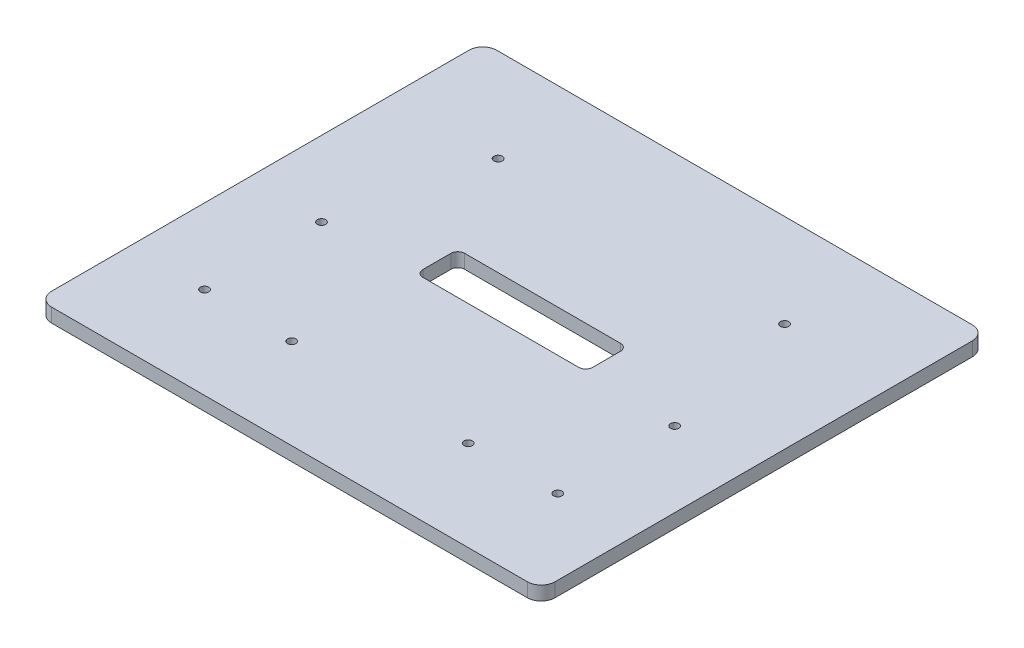
ISO-10303-21;
HEADER;
FILE_DESCRIPTION(('STEP AP214'),'2;1');
FILE_NAME('part.step','',(''),(''),'','','');
FILE_SCHEMA(('AUTOMOTIVE_DESIGN { 1 0 10303 214 1 1 1 1 }'));
ENDSEC;
DATA;
#1=APPLICATION_CONTEXT('core data for automotive mechanical design processes');
#2=APPLICATION_PROTOCOL_DEFINITION('international standard','automotive_design',2000,#1);
#3=PRODUCT_CONTEXT('',#1,'mechanical');
#4=PRODUCT('Part','Part','',(#3));
#5=PRODUCT_RELATED_PRODUCT_CATEGORY('part','',(#4));
#6=PRODUCT_DEFINITION_FORMATION('','',#4);
#7=PRODUCT_DEFINITION_CONTEXT('part definition',#1,'design');
#8=PRODUCT_DEFINITION('design','',#6,#7);
#9=PRODUCT_DEFINITION_SHAPE('','',#8);
#10=(LENGTH_UNIT() NAMED_UNIT(*) SI_UNIT(.MILLI.,.METRE.));
#11=(NAMED_UNIT(*) PLANE_ANGLE_UNIT() SI_UNIT($,.RADIAN.));
#12=(NAMED_UNIT(*) SI_UNIT($,.STERADIAN.) SOLID_ANGLE_UNIT());
#13=UNCERTAINTY_MEASURE_WITH_UNIT(LENGTH_MEASURE(1.E-05),#10,'distance_accuracy_value','');
#14=(GEOMETRIC_REPRESENTATION_CONTEXT(3) GLOBAL_UNCERTAINTY_ASSIGNED_CONTEXT((#13)) GLOBAL_UNIT_ASSIGNED_CONTEXT((#10,
#11,#12)) REPRESENTATION_CONTEXT('',''));
#15=CARTESIAN_POINT('',(0.,0.,0.));
#16=DIRECTION('',(0.,0.,1.));
#17=DIRECTION('',(1.,0.,0.));
#18=AXIS2_PLACEMENT_3D('',#15,#16,#17);
#19=CARTESIAN_POINT('',(109.134216211139,5.,-126.661644013292));
#20=DIRECTION('',(0.,-1.,0.));
#21=DIRECTION('',(0.,0.,-1.));
#22=AXIS2_PLACEMENT_3D('',#19,#20,#21);
#23=CYLINDRICAL_SURFACE('',#22,5.00000000000001);
#24=CARTESIAN_POINT('',(109.134216211139,0.,-126.661644013292));
#25=DIRECTION('',(0.,1.,0.));
#26=DIRECTION('',(0.,0.,-1.));
#27=AXIS2_PLACEMENT_3D('',#24,#25,#26);
#28=CIRCLE('',#27,5.00000000000001);
#29=CARTESIAN_POINT('',(114.134216211139,0.,-126.661644013292));
#30=VERTEX_POINT('',#29);
#31=CARTESIAN_POINT('',(109.134216211139,0.,-131.661644013292));
#32=VERTEX_POINT('',#31);
#33=EDGE_CURVE('E229',#30,#32,#28,.T.);
#34=ORIENTED_EDGE('',*,*,#33,.T.);
#35=DIRECTION('',(0.,-1.,0.));
#36=VECTOR('',#35,1.);
#37=CARTESIAN_POINT('',(109.134216211139,5.,-131.661644013292));
#38=LINE('',#37,#36);
#39=CARTESIAN_POINT('',(109.134216211139,5.,-131.661644013292));
#40=VERTEX_POINT('',#39);
#41=EDGE_CURVE('E286',#40,#32,#38,.T.);
#42=ORIENTED_EDGE('',*,*,#41,.F.);
#43=CARTESIAN_POINT('',(109.134216211139,5.,-126.661644013292));
#44=DIRECTION('',(0.,1.,0.));
#45=DIRECTION('',(0.,0.,-1.));
#46=AXIS2_PLACEMENT_3D('',#43,#44,#45);
#47=CIRCLE('',#46,5.00000000000001);
#48=CARTESIAN_POINT('',(114.134216211139,5.,-126.661644013292));
#49=VERTEX_POINT('',#48);
#50=EDGE_CURVE('E232',#49,#40,#47,.T.);
#51=ORIENTED_EDGE('',*,*,#50,.F.);
#52=DIRECTION('',(0.,-1.,0.));
#53=VECTOR('',#52,1.);
#54=CARTESIAN_POINT('',(114.134216211139,5.,-126.661644013292));
#55=LINE('',#54,#53);
#56=EDGE_CURVE('E250',#49,#30,#55,.T.);
#57=ORIENTED_EDGE('',*,*,#56,.T.);
#58=EDGE_LOOP('',(#34,#42,#51,#57));
#59=FACE_BOUND('',#58,.T.);
#60=ADVANCED_FACE('F32',(#59),#23,.T.);
#61=CARTESIAN_POINT('',(-61.8657837888607,5.,-131.661644013292));
#62=DIRECTION('',(0.,0.,1.));
#63=DIRECTION('',(1.,0.,0.));
#64=AXIS2_PLACEMENT_3D('',#61,#62,#63);
#65=PLANE('',#64);
#66=DIRECTION('',(-1.,0.,0.));
#67=VECTOR('',#66,1.);
#68=CARTESIAN_POINT('',(-61.8657837888607,0.,-131.661644013292));
#69=LINE('',#68,#67);
#70=CARTESIAN_POINT('',(-61.8657837888607,0.,-131.661644013292));
#71=VERTEX_POINT('',#70);
#72=EDGE_CURVE('E253',#32,#71,#69,.T.);
#73=ORIENTED_EDGE('',*,*,#72,.T.);
#74=DIRECTION('',(0.,-1.,0.));
#75=VECTOR('',#74,1.);
#76=CARTESIAN_POINT('',(-61.8657837888607,5.,-131.661644013292));
#77=LINE('',#76,#75);
#78=CARTESIAN_POINT('',(-61.8657837888607,5.,-131.661644013292));
#79=VERTEX_POINT('',#78);
#80=EDGE_CURVE('E283',#79,#71,#77,.T.);
#81=ORIENTED_EDGE('',*,*,#80,.F.);
#82=DIRECTION('',(-1.,0.,0.));
#83=VECTOR('',#82,1.);
#84=CARTESIAN_POINT('',(-61.8657837888607,5.,-131.661644013292));
#85=LINE('',#84,#83);
#86=EDGE_CURVE('E235',#40,#79,#85,.T.);
#87=ORIENTED_EDGE('',*,*,#86,.F.);
#88=ORIENTED_EDGE('',*,*,#41,.T.);
#89=EDGE_LOOP('',(#73,#81,#87,#88));
#90=FACE_BOUND('',#89,.T.);
#91=ADVANCED_FACE('F349',(#90),#65,.F.);
#92=CARTESIAN_POINT('',(-61.8657837888607,5.,-126.661644013292));
#93=DIRECTION('',(0.,-1.,0.));
#94=DIRECTION('',(0.,0.,-1.));
#95=AXIS2_PLACEMENT_3D('',#92,#93,#94);
#96=CYLINDRICAL_SURFACE('',#95,4.99999999999999);
#97=CARTESIAN_POINT('',(-61.8657837888607,0.,-126.661644013292));
#98=DIRECTION('',(0.,1.,0.));
#99=DIRECTION('',(0.,0.,1.));
#100=AXIS2_PLACEMENT_3D('',#97,#98,#99);
#101=CIRCLE('',#100,4.99999999999999);
#102=CARTESIAN_POINT('',(-66.8657837888607,0.,-126.661644013292));
#103=VERTEX_POINT('',#102);
#104=EDGE_CURVE('E255',#71,#103,#101,.T.);
#105=ORIENTED_EDGE('',*,*,#104,.T.);
#106=DIRECTION('',(0.,-1.,0.));
#107=VECTOR('',#106,1.);
#108=CARTESIAN_POINT('',(-66.8657837888607,5.,-126.661644013292));
#109=LINE('',#108,#107);
#110=CARTESIAN_POINT('',(-66.8657837888607,5.,-126.661644013292));
#111=VERTEX_POINT('',#110);
#112=EDGE_CURVE('E280',#111,#103,#109,.T.);
#113=ORIENTED_EDGE('',*,*,#112,.F.);
#114=CARTESIAN_POINT('',(-61.8657837888607,5.,-126.661644013292));
#115=DIRECTION('',(0.,1.,0.));
#116=DIRECTION('',(0.,0.,1.));
#117=AXIS2_PLACEMENT_3D('',#114,#115,#116);
#118=CIRCLE('',#117,4.99999999999999);
#119=EDGE_CURVE('E238',#79,#111,#118,.T.);
#120=ORIENTED_EDGE('',*,*,#119,.F.);
#121=ORIENTED_EDGE('',*,*,#80,.T.);
#122=EDGE_LOOP('',(#105,#113,#120,#121));
#123=FACE_BOUND('',#122,.T.);
#124=ADVANCED_FACE('F354',(#123),#96,.T.);
#125=CARTESIAN_POINT('',(-66.8657837888607,5.,-126.661644013292));
#126=DIRECTION('',(1.,0.,0.));
#127=DIRECTION('',(0.,0.,-1.));
#128=AXIS2_PLACEMENT_3D('',#125,#126,#127);
#129=PLANE('',#128);
#130=DIRECTION('',(0.,0.,1.));
#131=VECTOR('',#130,1.);
#132=CARTESIAN_POINT('',(-66.8657837888607,0.,-126.661644013292));
#133=LINE('',#132,#131);
#134=CARTESIAN_POINT('',(-66.8657837888607,0.,23.3383559867076));
#135=VERTEX_POINT('',#134);
#136=EDGE_CURVE('E257',#103,#135,#133,.T.);
#137=ORIENTED_EDGE('',*,*,#136,.T.);
#138=DIRECTION('',(0.,-1.,0.));
#139=VECTOR('',#138,1.);
#140=CARTESIAN_POINT('',(-66.8657837888607,5.,23.3383559867076));
#141=LINE('',#140,#139);
#142=CARTESIAN_POINT('',(-66.8657837888607,5.,23.3383559867076));
#143=VERTEX_POINT('',#142);
#144=EDGE_CURVE('E277',#143,#135,#141,.T.);
#145=ORIENTED_EDGE('',*,*,#144,.F.);
#146=DIRECTION('',(0.,0.,1.));
#147=VECTOR('',#146,1.);
#148=CARTESIAN_POINT('',(-66.8657837888607,5.,-126.661644013292));
#149=LINE('',#148,#147);
#150=EDGE_CURVE('E240',#111,#143,#149,.T.);
#151=ORIENTED_EDGE('',*,*,#150,.F.);
#152=ORIENTED_EDGE('',*,*,#112,.T.);
#153=EDGE_LOOP('',(#137,#145,#151,#152));
#154=FACE_BOUND('',#153,.T.);
#155=ADVANCED_FACE('F388',(#154),#129,.F.);
#156=CARTESIAN_POINT('',(-61.8657837888607,5.,23.3383559867076));
#157=DIRECTION('',(0.,-1.,0.));
#158=DIRECTION('',(0.,0.,-1.));
#159=AXIS2_PLACEMENT_3D('',#156,#157,#158);
#160=CYLINDRICAL_SURFACE('',#159,5.);
#161=CARTESIAN_POINT('',(-61.8657837888607,0.,23.3383559867076));
#162=DIRECTION('',(0.,1.,0.));
#163=DIRECTION('',(0.,0.,-1.));
#164=AXIS2_PLACEMENT_3D('',#161,#162,#163);
#165=CIRCLE('',#164,5.);
#166=CARTESIAN_POINT('',(-61.8657837888607,0.,28.3383559867076));
#167=VERTEX_POINT('',#166);
#168=EDGE_CURVE('E259',#135,#167,#165,.T.);
#169=ORIENTED_EDGE('',*,*,#168,.T.);
#170=DIRECTION('',(0.,-1.,0.));
#171=VECTOR('',#170,1.);
#172=CARTESIAN_POINT('',(-61.8657837888607,5.,28.3383559867076));
#173=LINE('',#172,#171);
#174=CARTESIAN_POINT('',(-61.8657837888607,5.,28.3383559867076));
#175=VERTEX_POINT('',#174);
#176=EDGE_CURVE('E274',#175,#167,#173,.T.);
#177=ORIENTED_EDGE('',*,*,#176,.F.);
#178=CARTESIAN_POINT('',(-61.8657837888607,5.,23.3383559867076));
#179=DIRECTION('',(0.,1.,0.));
#180=DIRECTION('',(0.,0.,-1.));
#181=AXIS2_PLACEMENT_3D('',#178,#179,#180);
#182=CIRCLE('',#181,5.);
#183=EDGE_CURVE('E242',#143,#175,#182,.T.);
#184=ORIENTED_EDGE('',*,*,#183,.F.);
#185=ORIENTED_EDGE('',*,*,#144,.T.);
#186=EDGE_LOOP('',(#169,#177,#184,#185));
#187=FACE_BOUND('',#186,.T.);
#188=ADVANCED_FACE('F384',(#187),#160,.T.);
#189=CARTESIAN_POINT('',(-61.8657837888607,5.,28.3383559867076));
#190=DIRECTION('',(0.,0.,-1.));
#191=DIRECTION('',(-1.,0.,0.));
#192=AXIS2_PLACEMENT_3D('',#189,#190,#191);
#193=PLANE('',#192);
#194=DIRECTION('',(1.,0.,0.));
#195=VECTOR('',#194,1.);
#196=CARTESIAN_POINT('',(-61.8657837888607,0.,28.3383559867076));
#197=LINE('',#196,#195);
#198=CARTESIAN_POINT('',(109.134216211139,0.,28.3383559867076));
#199=VERTEX_POINT('',#198);
#200=EDGE_CURVE('E261',#167,#199,#197,.T.);
#201=ORIENTED_EDGE('',*,*,#200,.T.);
#202=DIRECTION('',(0.,-1.,0.));
#203=VECTOR('',#202,1.);
#204=CARTESIAN_POINT('',(109.134216211139,5.,28.3383559867076));
#205=LINE('',#204,#203);
#206=CARTESIAN_POINT('',(109.134216211139,5.,28.3383559867076));
#207=VERTEX_POINT('',#206);
#208=EDGE_CURVE('E271',#207,#199,#205,.T.);
#209=ORIENTED_EDGE('',*,*,#208,.F.);
#210=DIRECTION('',(1.,0.,0.));
#211=VECTOR('',#210,1.);
#212=CARTESIAN_POINT('',(-61.8657837888607,5.,28.3383559867076));
#213=LINE('',#212,#211);
#214=EDGE_CURVE('E244',#175,#207,#213,.T.);
#215=ORIENTED_EDGE('',*,*,#214,.F.);
#216=ORIENTED_EDGE('',*,*,#176,.T.);
#217=EDGE_LOOP('',(#201,#209,#215,#216));
#218=FACE_BOUND('',#217,.T.);
#219=ADVANCED_FACE('F379',(#218),#193,.F.);
#220=CARTESIAN_POINT('',(109.134216211139,5.,23.3383559867076));
#221=DIRECTION('',(0.,-1.,0.));
#222=DIRECTION('',(0.,0.,-1.));
#223=AXIS2_PLACEMENT_3D('',#220,#221,#222);
#224=CYLINDRICAL_SURFACE('',#223,5.);
#225=CARTESIAN_POINT('',(109.134216211139,0.,23.3383559867076));
#226=DIRECTION('',(0.,1.,0.));
#227=DIRECTION('',(0.,0.,1.));
#228=AXIS2_PLACEMENT_3D('',#225,#226,#227);
#229=CIRCLE('',#228,5.);
#230=CARTESIAN_POINT('',(114.134216211139,0.,23.3383559867076));
#231=VERTEX_POINT('',#230);
#232=EDGE_CURVE('E263',#199,#231,#229,.T.);
#233=ORIENTED_EDGE('',*,*,#232,.T.);
#234=DIRECTION('',(0.,-1.,0.));
#235=VECTOR('',#234,1.);
#236=CARTESIAN_POINT('',(114.134216211139,5.,23.3383559867076));
#237=LINE('',#236,#235);
#238=CARTESIAN_POINT('',(114.134216211139,5.,23.3383559867076));
#239=VERTEX_POINT('',#238);
#240=EDGE_CURVE('E268',#239,#231,#237,.T.);
#241=ORIENTED_EDGE('',*,*,#240,.F.);
#242=CARTESIAN_POINT('',(109.134216211139,5.,23.3383559867076));
#243=DIRECTION('',(0.,1.,0.));
#244=DIRECTION('',(0.,0.,1.));
#245=AXIS2_PLACEMENT_3D('',#242,#243,#244);
#246=CIRCLE('',#245,5.);
#247=EDGE_CURVE('E246',#207,#239,#246,.T.);
#248=ORIENTED_EDGE('',*,*,#247,.F.);
#249=ORIENTED_EDGE('',*,*,#208,.T.);
#250=EDGE_LOOP('',(#233,#241,#248,#249));
#251=FACE_BOUND('',#250,.T.);
#252=ADVANCED_FACE('F374',(#251),#224,.T.);
#253=CARTESIAN_POINT('',(114.134216211139,5.,-126.661644013292));
#254=DIRECTION('',(-1.,0.,0.));
#255=DIRECTION('',(0.,0.,1.));
#256=AXIS2_PLACEMENT_3D('',#253,#254,#255);
#257=PLANE('',#256);
#258=DIRECTION('',(0.,0.,-1.));
#259=VECTOR('',#258,1.);
#260=CARTESIAN_POINT('',(114.134216211139,0.,-126.661644013292));
#261=LINE('',#260,#259);
#262=EDGE_CURVE('E236',#231,#30,#261,.T.);
#263=ORIENTED_EDGE('',*,*,#262,.T.);
#264=ORIENTED_EDGE('',*,*,#56,.F.);
#265=DIRECTION('',(0.,0.,-1.));
#266=VECTOR('',#265,1.);
#267=CARTESIAN_POINT('',(114.134216211139,5.,-126.661644013292));
#268=LINE('',#267,#266);
#269=EDGE_CURVE('E248',#239,#49,#268,.T.);
#270=ORIENTED_EDGE('',*,*,#269,.F.);
#271=ORIENTED_EDGE('',*,*,#240,.T.);
#272=EDGE_LOOP('',(#263,#264,#270,#271));
#273=FACE_BOUND('',#272,.T.);
#274=ADVANCED_FACE('F372',(#273),#257,.F.);
#275=CARTESIAN_POINT('',(109.134216211139,5.,-126.661644013292));
#276=DIRECTION('',(0.,-1.,0.));
#277=DIRECTION('',(0.,0.,-1.));
#278=AXIS2_PLACEMENT_3D('',#275,#276,#277);
#279=PLANE('',#278);
#280=DIRECTION('',(-1.,0.,0.));
#281=VECTOR('',#280,1.);
#282=CARTESIAN_POINT('',(-4.36578378886074,5.,-62.6616440132924));
#283=LINE('',#282,#281);
#284=CARTESIAN_POINT('',(51.6342162111393,5.,-62.6616440132924));
#285=VERTEX_POINT('',#284);
#286=CARTESIAN_POINT('',(-4.36578378886074,5.,-62.6616440132924));
#287=VERTEX_POINT('',#286);
#288=EDGE_CURVE('E155',#285,#287,#283,.T.);
#289=ORIENTED_EDGE('',*,*,#288,.F.);
#290=CARTESIAN_POINT('',(51.6342162111393,5.,-60.1616440132924));
#291=DIRECTION('',(0.,1.,0.));
#292=DIRECTION('',(0.,0.,1.));
#293=AXIS2_PLACEMENT_3D('',#290,#291,#292);
#294=CIRCLE('',#293,2.5);
#295=CARTESIAN_POINT('',(54.1342162111393,5.,-60.1616440132924));
#296=VERTEX_POINT('',#295);
#297=EDGE_CURVE('E46',#296,#285,#294,.T.);
#298=ORIENTED_EDGE('',*,*,#297,.F.);
#299=DIRECTION('',(0.,0.,-1.));
#300=VECTOR('',#299,1.);
#301=CARTESIAN_POINT('',(54.1342162111393,5.,-60.1616440132924));
#302=LINE('',#301,#300);
#303=CARTESIAN_POINT('',(54.1342162111393,5.,-50.1616440132924));
#304=VERTEX_POINT('',#303);
#305=EDGE_CURVE('E177',#304,#296,#302,.T.);
#306=ORIENTED_EDGE('',*,*,#305,.F.);
#307=CARTESIAN_POINT('',(51.6342162111393,5.,-50.1616440132924));
#308=DIRECTION('',(0.,1.,0.));
#309=DIRECTION('',(0.,0.,-1.));
#310=AXIS2_PLACEMENT_3D('',#307,#308,#309);
#311=CIRCLE('',#310,2.5);
#312=CARTESIAN_POINT('',(51.6342162111393,5.,-47.6616440132924));
#313=VERTEX_POINT('',#312);
#314=EDGE_CURVE('E174',#313,#304,#311,.T.);
#315=ORIENTED_EDGE('',*,*,#314,.F.);
#316=DIRECTION('',(1.,0.,0.));
#317=VECTOR('',#316,1.);
#318=CARTESIAN_POINT('',(-4.36578378886074,5.,-47.6616440132924));
#319=LINE('',#318,#317);
#320=CARTESIAN_POINT('',(-4.36578378886074,5.,-47.6616440132924));
#321=VERTEX_POINT('',#320);
#322=EDGE_CURVE('E171',#321,#313,#319,.T.);
#323=ORIENTED_EDGE('',*,*,#322,.F.);
#324=CARTESIAN_POINT('',(-4.36578378886074,5.,-50.1616440132924));
#325=DIRECTION('',(0.,1.,0.));
#326=DIRECTION('',(0.,0.,-1.));
#327=AXIS2_PLACEMENT_3D('',#324,#325,#326);
#328=CIRCLE('',#327,2.5);
#329=CARTESIAN_POINT('',(-6.86578378886074,5.,-50.1616440132924));
#330=VERTEX_POINT('',#329);
#331=EDGE_CURVE('E165',#330,#321,#328,.T.);
#332=ORIENTED_EDGE('',*,*,#331,.F.);
#333=DIRECTION('',(0.,0.,1.));
#334=VECTOR('',#333,1.);
#335=CARTESIAN_POINT('',(-6.86578378886074,5.,-60.1616440132924));
#336=LINE('',#335,#334);
#337=CARTESIAN_POINT('',(-6.86578378886074,5.,-60.1616440132924));
#338=VERTEX_POINT('',#337);
#339=EDGE_CURVE('E163',#338,#330,#336,.T.);
#340=ORIENTED_EDGE('',*,*,#339,.F.);
#341=CARTESIAN_POINT('',(-4.36578378886074,5.,-60.1616440132924));
#342=DIRECTION('',(0.,1.,0.));
#343=DIRECTION('',(0.,0.,1.));
#344=AXIS2_PLACEMENT_3D('',#341,#342,#343);
#345=CIRCLE('',#344,2.5);
#346=EDGE_CURVE('E146',#287,#338,#345,.T.);
#347=ORIENTED_EDGE('',*,*,#346,.F.);
#348=EDGE_LOOP('',(#289,#298,#306,#315,#323,#332,#340,#347));
#349=FACE_BOUND('',#348,.T.);
#350=CARTESIAN_POINT('',(-39.8657837888607,5.,-4.61164401329236));
#351=DIRECTION('',(0.,1.,0.));
#352=DIRECTION('',(0.,0.,1.));
#353=AXIS2_PLACEMENT_3D('',#350,#351,#352);
#354=CIRCLE('',#353,1.5);
#355=CARTESIAN_POINT('',(-39.8657837888607,5.,-3.11164401329235));
#356=VERTEX_POINT('',#355);
#357=EDGE_CURVE('E193',#356,#356,#354,.T.);
#358=ORIENTED_EDGE('',*,*,#357,.F.);
#359=EDGE_LOOP('',(#358));
#360=FACE_BOUND('',#359,.T.);
#361=CARTESIAN_POINT('',(87.1342162111393,5.,-46.6616440132924));
#362=DIRECTION('',(0.,1.,0.));
#363=DIRECTION('',(0.,0.,1.));
#364=AXIS2_PLACEMENT_3D('',#361,#362,#363);
#365=CIRCLE('',#364,1.5);
#366=CARTESIAN_POINT('',(87.1342162111393,5.,-45.1616440132924));
#367=VERTEX_POINT('',#366);
#368=EDGE_CURVE('E197',#367,#367,#365,.T.);
#369=ORIENTED_EDGE('',*,*,#368,.F.);
#370=EDGE_LOOP('',(#369));
#371=FACE_BOUND('',#370,.T.);
#372=CARTESIAN_POINT('',(87.1342162111393,5.,-4.61164401329236));
#373=DIRECTION('',(0.,1.,0.));
#374=DIRECTION('',(0.,0.,1.));
#375=AXIS2_PLACEMENT_3D('',#372,#373,#374);
#376=CIRCLE('',#375,1.5);
#377=CARTESIAN_POINT('',(87.1342162111393,5.,-3.11164401329236));
#378=VERTEX_POINT('',#377);
#379=EDGE_CURVE('E182',#378,#378,#376,.T.);
#380=ORIENTED_EDGE('',*,*,#379,.F.);
#381=EDGE_LOOP('',(#380));
#382=FACE_BOUND('',#381,.T.);
#383=CARTESIAN_POINT('',(-39.8657837888607,5.,-46.6616440132924));
#384=DIRECTION('',(0.,1.,0.));
#385=DIRECTION('',(0.,0.,1.));
#386=AXIS2_PLACEMENT_3D('',#383,#384,#385);
#387=CIRCLE('',#386,1.5);
#388=CARTESIAN_POINT('',(-39.8657837888607,5.,-45.1616440132924));
#389=VERTEX_POINT('',#388);
#390=EDGE_CURVE('E202',#389,#389,#387,.T.);
#391=ORIENTED_EDGE('',*,*,#390,.F.);
#392=EDGE_LOOP('',(#391));
#393=FACE_BOUND('',#392,.T.);
#394=CARTESIAN_POINT('',(75.1342162111393,5.,-98.1616440132924));
#395=DIRECTION('',(0.,1.,0.));
#396=DIRECTION('',(0.,0.,1.));
#397=AXIS2_PLACEMENT_3D('',#394,#395,#396);
#398=CIRCLE('',#397,1.5);
#399=CARTESIAN_POINT('',(75.1342162111393,5.,-96.6616440132924));
#400=VERTEX_POINT('',#399);
#401=EDGE_CURVE('E211',#400,#400,#398,.T.);
#402=ORIENTED_EDGE('',*,*,#401,.F.);
#403=EDGE_LOOP('',(#402));
#404=FACE_BOUND('',#403,.T.);
#405=CARTESIAN_POINT('',(-8.11578378886073,5.,-4.16164401329237));
#406=DIRECTION('',(0.,1.,0.));
#407=DIRECTION('',(0.,0.,1.));
#408=AXIS2_PLACEMENT_3D('',#405,#406,#407);
#409=CIRCLE('',#408,1.5);
#410=CARTESIAN_POINT('',(-8.11578378886073,5.,-2.66164401329237));
#411=VERTEX_POINT('',#410);
#412=EDGE_CURVE('E217',#411,#411,#409,.T.);
#413=ORIENTED_EDGE('',*,*,#412,.F.);
#414=EDGE_LOOP('',(#413));
#415=FACE_BOUND('',#414,.T.);
#416=CARTESIAN_POINT('',(55.3842162111393,5.,-4.16164401329237));
#417=DIRECTION('',(0.,1.,0.));
#418=DIRECTION('',(0.,0.,1.));
#419=AXIS2_PLACEMENT_3D('',#416,#417,#418);
#420=CIRCLE('',#419,1.5);
#421=CARTESIAN_POINT('',(55.3842162111393,5.,-2.66164401329237));
#422=VERTEX_POINT('',#421);
#423=EDGE_CURVE('E223',#422,#422,#420,.T.);
#424=ORIENTED_EDGE('',*,*,#423,.F.);
#425=EDGE_LOOP('',(#424));
#426=FACE_BOUND('',#425,.T.);
#427=CARTESIAN_POINT('',(-27.8657837888607,5.,-98.1616440132924));
#428=DIRECTION('',(0.,1.,0.));
#429=DIRECTION('',(0.,0.,1.));
#430=AXIS2_PLACEMENT_3D('',#427,#428,#429);
#431=CIRCLE('',#430,1.5);
#432=CARTESIAN_POINT('',(-27.8657837888607,5.,-96.6616440132924));
#433=VERTEX_POINT('',#432);
#434=EDGE_CURVE('E210',#433,#433,#431,.T.);
#435=ORIENTED_EDGE('',*,*,#434,.F.);
#436=EDGE_LOOP('',(#435));
#437=FACE_BOUND('',#436,.T.);
#438=ORIENTED_EDGE('',*,*,#50,.T.);
#439=ORIENTED_EDGE('',*,*,#86,.T.);
#440=ORIENTED_EDGE('',*,*,#119,.T.);
#441=ORIENTED_EDGE('',*,*,#150,.T.);
#442=ORIENTED_EDGE('',*,*,#183,.T.);
#443=ORIENTED_EDGE('',*,*,#214,.T.);
#444=ORIENTED_EDGE('',*,*,#247,.T.);
#445=ORIENTED_EDGE('',*,*,#269,.T.);
#446=EDGE_LOOP('',(#438,#439,#440,#441,#442,#443,#444,#445));
#447=FACE_BOUND('',#446,.T.);
#448=ADVANCED_FACE('F159',(#349,#360,#371,#382,#393,#404,#415,#426,#437,#447),#279,.F.);
#449=CARTESIAN_POINT('',(109.134216211139,0.,-126.661644013292));
#450=DIRECTION('',(0.,-1.,0.));
#451=DIRECTION('',(0.,0.,-1.));
#452=AXIS2_PLACEMENT_3D('',#449,#450,#451);
#453=PLANE('',#452);
#454=CARTESIAN_POINT('',(51.6342162111393,0.,-60.1616440132924));
#455=DIRECTION('',(0.,-1.,0.));
#456=DIRECTION('',(0.,0.,-1.));
#457=AXIS2_PLACEMENT_3D('',#454,#455,#456);
#458=CIRCLE('',#457,2.5);
#459=CARTESIAN_POINT('',(51.6342162111393,0.,-62.6616440132924));
#460=VERTEX_POINT('',#459);
#461=CARTESIAN_POINT('',(54.1342162111393,0.,-60.1616440132924));
#462=VERTEX_POINT('',#461);
#463=EDGE_CURVE('E11',#460,#462,#458,.T.);
#464=ORIENTED_EDGE('',*,*,#463,.F.);
#465=DIRECTION('',(1.,0.,0.));
#466=VECTOR('',#465,1.);
#467=CARTESIAN_POINT('',(109.134216211139,0.,-62.6616440132924));
#468=LINE('',#467,#466);
#469=CARTESIAN_POINT('',(-4.36578378886074,0.,-62.6616440132924));
#470=VERTEX_POINT('',#469);
#471=EDGE_CURVE('E289',#470,#460,#468,.T.);
#472=ORIENTED_EDGE('',*,*,#471,.F.);
#473=CARTESIAN_POINT('',(-4.36578378886074,0.,-60.1616440132924));
#474=DIRECTION('',(0.,-1.,0.));
#475=DIRECTION('',(0.,0.,-1.));
#476=AXIS2_PLACEMENT_3D('',#473,#474,#475);
#477=CIRCLE('',#476,2.5);
#478=CARTESIAN_POINT('',(-6.86578378886074,0.,-60.1616440132924));
#479=VERTEX_POINT('',#478);
#480=EDGE_CURVE('E149',#479,#470,#477,.T.);
#481=ORIENTED_EDGE('',*,*,#480,.F.);
#482=DIRECTION('',(0.,0.,-1.));
#483=VECTOR('',#482,1.);
#484=CARTESIAN_POINT('',(-6.86578378886077,0.,-126.661644013292));
#485=LINE('',#484,#483);
#486=CARTESIAN_POINT('',(-6.86578378886074,0.,-50.1616440132924));
#487=VERTEX_POINT('',#486);
#488=EDGE_CURVE('E301',#487,#479,#485,.T.);
#489=ORIENTED_EDGE('',*,*,#488,.F.);
#490=CARTESIAN_POINT('',(-4.36578378886074,0.,-50.1616440132924));
#491=DIRECTION('',(0.,-1.,0.));
#492=DIRECTION('',(0.,0.,-1.));
#493=AXIS2_PLACEMENT_3D('',#490,#491,#492);
#494=CIRCLE('',#493,2.5);
#495=CARTESIAN_POINT('',(-4.36578378886074,0.,-47.6616440132924));
#496=VERTEX_POINT('',#495);
#497=EDGE_CURVE('E303',#496,#487,#494,.T.);
#498=ORIENTED_EDGE('',*,*,#497,.F.);
#499=DIRECTION('',(-1.,0.,0.));
#500=VECTOR('',#499,1.);
#501=CARTESIAN_POINT('',(109.134216211139,0.,-47.6616440132924));
#502=LINE('',#501,#500);
#503=CARTESIAN_POINT('',(51.6342162111393,0.,-47.6616440132924));
#504=VERTEX_POINT('',#503);
#505=EDGE_CURVE('E305',#504,#496,#502,.T.);
#506=ORIENTED_EDGE('',*,*,#505,.F.);
#507=CARTESIAN_POINT('',(51.6342162111393,0.,-50.1616440132924));
#508=DIRECTION('',(0.,-1.,0.));
#509=DIRECTION('',(0.,0.,-1.));
#510=AXIS2_PLACEMENT_3D('',#507,#508,#509);
#511=CIRCLE('',#510,2.5);
#512=CARTESIAN_POINT('',(54.1342162111393,0.,-50.1616440132924));
#513=VERTEX_POINT('',#512);
#514=EDGE_CURVE('E307',#513,#504,#511,.T.);
#515=ORIENTED_EDGE('',*,*,#514,.F.);
#516=DIRECTION('',(0.,0.,1.));
#517=VECTOR('',#516,1.);
#518=CARTESIAN_POINT('',(54.1342162111393,0.,-126.661644013292));
#519=LINE('',#518,#517);
#520=EDGE_CURVE('E39',#462,#513,#519,.T.);
#521=ORIENTED_EDGE('',*,*,#520,.F.);
#522=EDGE_LOOP('',(#464,#472,#481,#489,#498,#506,#515,#521));
#523=FACE_BOUND('',#522,.T.);
#524=CARTESIAN_POINT('',(-39.8657837888607,0.,-4.61164401329236));
#525=DIRECTION('',(0.,-1.,0.));
#526=DIRECTION('',(0.,0.,-1.));
#527=AXIS2_PLACEMENT_3D('',#524,#525,#526);
#528=CIRCLE('',#527,1.5);
#529=CARTESIAN_POINT('',(-39.8657837888607,0.,-6.11164401329236));
#530=VERTEX_POINT('',#529);
#531=EDGE_CURVE('E206',#530,#530,#528,.T.);
#532=ORIENTED_EDGE('',*,*,#531,.F.);
#533=EDGE_LOOP('',(#532));
#534=FACE_BOUND('',#533,.T.);
#535=CARTESIAN_POINT('',(87.1342162111393,0.,-46.6616440132924));
#536=DIRECTION('',(0.,-1.,0.));
#537=DIRECTION('',(0.,0.,-1.));
#538=AXIS2_PLACEMENT_3D('',#535,#536,#537);
#539=CIRCLE('',#538,1.5);
#540=CARTESIAN_POINT('',(87.1342162111393,0.,-48.1616440132924));
#541=VERTEX_POINT('',#540);
#542=EDGE_CURVE('E294',#541,#541,#539,.T.);
#543=ORIENTED_EDGE('',*,*,#542,.F.);
#544=EDGE_LOOP('',(#543));
#545=FACE_BOUND('',#544,.T.);
#546=CARTESIAN_POINT('',(87.1342162111393,0.,-4.61164401329236));
#547=DIRECTION('',(0.,-1.,0.));
#548=DIRECTION('',(0.,0.,-1.));
#549=AXIS2_PLACEMENT_3D('',#546,#547,#548);
#550=CIRCLE('',#549,1.5);
#551=CARTESIAN_POINT('',(87.1342162111393,0.,-6.11164401329236));
#552=VERTEX_POINT('',#551);
#553=EDGE_CURVE('E196',#552,#552,#550,.T.);
#554=ORIENTED_EDGE('',*,*,#553,.F.);
#555=EDGE_LOOP('',(#554));
#556=FACE_BOUND('',#555,.T.);
#557=CARTESIAN_POINT('',(-39.8657837888607,0.,-46.6616440132924));
#558=DIRECTION('',(0.,-1.,0.));
#559=DIRECTION('',(0.,0.,-1.));
#560=AXIS2_PLACEMENT_3D('',#557,#558,#559);
#561=CIRCLE('',#560,1.5);
#562=CARTESIAN_POINT('',(-39.8657837888607,0.,-48.1616440132924));
#563=VERTEX_POINT('',#562);
#564=EDGE_CURVE('E205',#563,#563,#561,.T.);
#565=ORIENTED_EDGE('',*,*,#564,.F.);
#566=EDGE_LOOP('',(#565));
#567=FACE_BOUND('',#566,.T.);
#568=CARTESIAN_POINT('',(75.1342162111393,0.,-98.1616440132924));
#569=DIRECTION('',(0.,1.,0.));
#570=DIRECTION('',(0.,0.,1.));
#571=AXIS2_PLACEMENT_3D('',#568,#569,#570);
#572=CIRCLE('',#571,1.5);
#573=CARTESIAN_POINT('',(75.1342162111393,0.,-96.6616440132924));
#574=VERTEX_POINT('',#573);
#575=EDGE_CURVE('E207',#574,#574,#572,.T.);
#576=ORIENTED_EDGE('',*,*,#575,.T.);
#577=EDGE_LOOP('',(#576));
#578=FACE_BOUND('',#577,.T.);
#579=CARTESIAN_POINT('',(-8.11578378886073,0.,-4.16164401329237));
#580=DIRECTION('',(0.,1.,0.));
#581=DIRECTION('',(0.,0.,1.));
#582=AXIS2_PLACEMENT_3D('',#579,#580,#581);
#583=CIRCLE('',#582,1.5);
#584=CARTESIAN_POINT('',(-8.11578378886073,0.,-2.66164401329237));
#585=VERTEX_POINT('',#584);
#586=EDGE_CURVE('E214',#585,#585,#583,.T.);
#587=ORIENTED_EDGE('',*,*,#586,.T.);
#588=EDGE_LOOP('',(#587));
#589=FACE_BOUND('',#588,.T.);
#590=CARTESIAN_POINT('',(55.3842162111393,0.,-4.16164401329237));
#591=DIRECTION('',(0.,1.,0.));
#592=DIRECTION('',(0.,0.,1.));
#593=AXIS2_PLACEMENT_3D('',#590,#591,#592);
#594=CIRCLE('',#593,1.5);
#595=CARTESIAN_POINT('',(55.3842162111393,0.,-2.66164401329237));
#596=VERTEX_POINT('',#595);
#597=EDGE_CURVE('E220',#596,#596,#594,.T.);
#598=ORIENTED_EDGE('',*,*,#597,.T.);
#599=EDGE_LOOP('',(#598));
#600=FACE_BOUND('',#599,.T.);
#601=CARTESIAN_POINT('',(-27.8657837888607,0.,-98.1616440132924));
#602=DIRECTION('',(0.,1.,0.));
#603=DIRECTION('',(0.,0.,1.));
#604=AXIS2_PLACEMENT_3D('',#601,#602,#603);
#605=CIRCLE('',#604,1.5);
#606=CARTESIAN_POINT('',(-27.8657837888607,0.,-96.6616440132924));
#607=VERTEX_POINT('',#606);
#608=EDGE_CURVE('E226',#607,#607,#605,.T.);
#609=ORIENTED_EDGE('',*,*,#608,.T.);
#610=EDGE_LOOP('',(#609));
#611=FACE_BOUND('',#610,.T.);
#612=ORIENTED_EDGE('',*,*,#33,.F.);
#613=ORIENTED_EDGE('',*,*,#262,.F.);
#614=ORIENTED_EDGE('',*,*,#232,.F.);
#615=ORIENTED_EDGE('',*,*,#200,.F.);
#616=ORIENTED_EDGE('',*,*,#168,.F.);
#617=ORIENTED_EDGE('',*,*,#136,.F.);
#618=ORIENTED_EDGE('',*,*,#104,.F.);
#619=ORIENTED_EDGE('',*,*,#72,.F.);
#620=EDGE_LOOP('',(#612,#613,#614,#615,#616,#617,#618,#619));
#621=FACE_BOUND('',#620,.T.);
#622=ADVANCED_FACE('F322',(#523,#534,#545,#556,#567,#578,#589,#600,#611,#621),#453,.T.);
#623=CARTESIAN_POINT('',(-27.8657837888607,0.,-98.1616440132924));
#624=DIRECTION('',(0.,1.,0.));
#625=DIRECTION('',(0.,0.,1.));
#626=AXIS2_PLACEMENT_3D('',#623,#624,#625);
#627=CYLINDRICAL_SURFACE('',#626,1.5);
#628=ORIENTED_EDGE('',*,*,#608,.F.);
#629=EDGE_LOOP('',(#628));
#630=FACE_BOUND('',#629,.T.);
#631=ORIENTED_EDGE('',*,*,#434,.T.);
#632=EDGE_LOOP('',(#631));
#633=FACE_BOUND('',#632,.T.);
#634=ADVANCED_FACE('F408',(#630,#633),#627,.F.);
#635=CARTESIAN_POINT('',(55.3842162111393,0.,-4.16164401329237));
#636=DIRECTION('',(0.,1.,0.));
#637=DIRECTION('',(0.,0.,1.));
#638=AXIS2_PLACEMENT_3D('',#635,#636,#637);
#639=CYLINDRICAL_SURFACE('',#638,1.5);
#640=ORIENTED_EDGE('',*,*,#597,.F.);
#641=EDGE_LOOP('',(#640));
#642=FACE_BOUND('',#641,.T.);
#643=ORIENTED_EDGE('',*,*,#423,.T.);
#644=EDGE_LOOP('',(#643));
#645=FACE_BOUND('',#644,.T.);
#646=ADVANCED_FACE('F413',(#642,#645),#639,.F.);
#647=CARTESIAN_POINT('',(-8.11578378886073,0.,-4.16164401329237));
#648=DIRECTION('',(0.,1.,0.));
#649=DIRECTION('',(0.,0.,1.));
#650=AXIS2_PLACEMENT_3D('',#647,#648,#649);
#651=CYLINDRICAL_SURFACE('',#650,1.5);
#652=ORIENTED_EDGE('',*,*,#586,.F.);
#653=EDGE_LOOP('',(#652));
#654=FACE_BOUND('',#653,.T.);
#655=ORIENTED_EDGE('',*,*,#412,.T.);
#656=EDGE_LOOP('',(#655));
#657=FACE_BOUND('',#656,.T.);
#658=ADVANCED_FACE('F417',(#654,#657),#651,.F.);
#659=CARTESIAN_POINT('',(75.1342162111393,0.,-98.1616440132924));
#660=DIRECTION('',(0.,1.,0.));
#661=DIRECTION('',(0.,0.,1.));
#662=AXIS2_PLACEMENT_3D('',#659,#660,#661);
#663=CYLINDRICAL_SURFACE('',#662,1.5);
#664=ORIENTED_EDGE('',*,*,#575,.F.);
#665=EDGE_LOOP('',(#664));
#666=FACE_BOUND('',#665,.T.);
#667=ORIENTED_EDGE('',*,*,#401,.T.);
#668=EDGE_LOOP('',(#667));
#669=FACE_BOUND('',#668,.T.);
#670=ADVANCED_FACE('F421',(#666,#669),#663,.F.);
#671=CARTESIAN_POINT('',(-39.8657837888607,-5.,-46.6616440132924));
#672=DIRECTION('',(0.,1.,0.));
#673=DIRECTION('',(0.,0.,1.));
#674=AXIS2_PLACEMENT_3D('',#671,#672,#673);
#675=CYLINDRICAL_SURFACE('',#674,1.5);
#676=ORIENTED_EDGE('',*,*,#564,.T.);
#677=EDGE_LOOP('',(#676));
#678=FACE_BOUND('',#677,.T.);
#679=ORIENTED_EDGE('',*,*,#390,.T.);
#680=EDGE_LOOP('',(#679));
#681=FACE_BOUND('',#680,.T.);
#682=ADVANCED_FACE('F425',(#678,#681),#675,.F.);
#683=CARTESIAN_POINT('',(87.1342162111393,-5.,-4.61164401329236));
#684=DIRECTION('',(0.,1.,0.));
#685=DIRECTION('',(0.,0.,1.));
#686=AXIS2_PLACEMENT_3D('',#683,#684,#685);
#687=CYLINDRICAL_SURFACE('',#686,1.5);
#688=ORIENTED_EDGE('',*,*,#553,.T.);
#689=EDGE_LOOP('',(#688));
#690=FACE_BOUND('',#689,.T.);
#691=ORIENTED_EDGE('',*,*,#379,.T.);
#692=EDGE_LOOP('',(#691));
#693=FACE_BOUND('',#692,.T.);
#694=ADVANCED_FACE('F429',(#690,#693),#687,.F.);
#695=CARTESIAN_POINT('',(87.1342162111393,-5.,-46.6616440132924));
#696=DIRECTION('',(0.,1.,0.));
#697=DIRECTION('',(0.,0.,1.));
#698=AXIS2_PLACEMENT_3D('',#695,#696,#697);
#699=CYLINDRICAL_SURFACE('',#698,1.5);
#700=ORIENTED_EDGE('',*,*,#542,.T.);
#701=EDGE_LOOP('',(#700));
#702=FACE_BOUND('',#701,.T.);
#703=ORIENTED_EDGE('',*,*,#368,.T.);
#704=EDGE_LOOP('',(#703));
#705=FACE_BOUND('',#704,.T.);
#706=ADVANCED_FACE('F344',(#702,#705),#699,.F.);
#707=CARTESIAN_POINT('',(-39.8657837888607,-5.,-4.61164401329236));
#708=DIRECTION('',(0.,1.,0.));
#709=DIRECTION('',(0.,0.,1.));
#710=AXIS2_PLACEMENT_3D('',#707,#708,#709);
#711=CYLINDRICAL_SURFACE('',#710,1.5);
#712=ORIENTED_EDGE('',*,*,#531,.T.);
#713=EDGE_LOOP('',(#712));
#714=FACE_BOUND('',#713,.T.);
#715=ORIENTED_EDGE('',*,*,#357,.T.);
#716=EDGE_LOOP('',(#715));
#717=FACE_BOUND('',#716,.T.);
#718=ADVANCED_FACE('F337',(#714,#717),#711,.F.);
#719=CARTESIAN_POINT('',(51.6342162111393,-5.,-60.1616440132924));
#720=DIRECTION('',(0.,1.,0.));
#721=DIRECTION('',(0.,0.,1.));
#722=AXIS2_PLACEMENT_3D('',#719,#720,#721);
#723=CYLINDRICAL_SURFACE('',#722,2.5);
#724=ORIENTED_EDGE('',*,*,#463,.T.);
#725=DIRECTION('',(0.,1.,0.));
#726=VECTOR('',#725,1.);
#727=CARTESIAN_POINT('',(54.1342162111393,-5.,-60.1616440132924));
#728=LINE('',#727,#726);
#729=EDGE_CURVE('E180',#462,#296,#728,.T.);
#730=ORIENTED_EDGE('',*,*,#729,.T.);
#731=ORIENTED_EDGE('',*,*,#297,.T.);
#732=DIRECTION('',(0.,1.,0.));
#733=VECTOR('',#732,1.);
#734=CARTESIAN_POINT('',(51.6342162111393,-5.,-62.6616440132924));
#735=LINE('',#734,#733);
#736=EDGE_CURVE('E152',#460,#285,#735,.T.);
#737=ORIENTED_EDGE('',*,*,#736,.F.);
#738=EDGE_LOOP('',(#724,#730,#731,#737));
#739=FACE_BOUND('',#738,.T.);
#740=ADVANCED_FACE('F335',(#739),#723,.F.);
#741=CARTESIAN_POINT('',(54.1342162111393,-5.,-60.1616440132924));
#742=DIRECTION('',(1.,0.,0.));
#743=DIRECTION('',(0.,0.,-1.));
#744=AXIS2_PLACEMENT_3D('',#741,#742,#743);
#745=PLANE('',#744);
#746=ORIENTED_EDGE('',*,*,#520,.T.);
#747=DIRECTION('',(0.,1.,0.));
#748=VECTOR('',#747,1.);
#749=CARTESIAN_POINT('',(54.1342162111393,-5.,-50.1616440132924));
#750=LINE('',#749,#748);
#751=EDGE_CURVE('E183',#513,#304,#750,.T.);
#752=ORIENTED_EDGE('',*,*,#751,.T.);
#753=ORIENTED_EDGE('',*,*,#305,.T.);
#754=ORIENTED_EDGE('',*,*,#729,.F.);
#755=EDGE_LOOP('',(#746,#752,#753,#754));
#756=FACE_BOUND('',#755,.T.);
#757=ADVANCED_FACE('F312',(#756),#745,.F.);
#758=CARTESIAN_POINT('',(51.6342162111393,-5.,-50.1616440132924));
#759=DIRECTION('',(0.,1.,0.));
#760=DIRECTION('',(0.,0.,1.));
#761=AXIS2_PLACEMENT_3D('',#758,#759,#760);
#762=CYLINDRICAL_SURFACE('',#761,2.5);
#763=ORIENTED_EDGE('',*,*,#514,.T.);
#764=DIRECTION('',(0.,1.,0.));
#765=VECTOR('',#764,1.);
#766=CARTESIAN_POINT('',(51.6342162111393,-5.,-47.6616440132924));
#767=LINE('',#766,#765);
#768=EDGE_CURVE('E185',#504,#313,#767,.T.);
#769=ORIENTED_EDGE('',*,*,#768,.T.);
#770=ORIENTED_EDGE('',*,*,#314,.T.);
#771=ORIENTED_EDGE('',*,*,#751,.F.);
#772=EDGE_LOOP('',(#763,#769,#770,#771));
#773=FACE_BOUND('',#772,.T.);
#774=ADVANCED_FACE('F317',(#773),#762,.F.);
#775=CARTESIAN_POINT('',(-4.36578378886074,-5.,-47.6616440132924));
#776=DIRECTION('',(0.,0.,1.));
#777=DIRECTION('',(1.,0.,0.));
#778=AXIS2_PLACEMENT_3D('',#775,#776,#777);
#779=PLANE('',#778);
#780=ORIENTED_EDGE('',*,*,#505,.T.);
#781=DIRECTION('',(0.,1.,0.));
#782=VECTOR('',#781,1.);
#783=CARTESIAN_POINT('',(-4.36578378886074,-5.,-47.6616440132924));
#784=LINE('',#783,#782);
#785=EDGE_CURVE('E187',#496,#321,#784,.T.);
#786=ORIENTED_EDGE('',*,*,#785,.T.);
#787=ORIENTED_EDGE('',*,*,#322,.T.);
#788=ORIENTED_EDGE('',*,*,#768,.F.);
#789=EDGE_LOOP('',(#780,#786,#787,#788));
#790=FACE_BOUND('',#789,.T.);
#791=ADVANCED_FACE('F328',(#790),#779,.F.);
#792=CARTESIAN_POINT('',(-4.36578378886074,-5.,-50.1616440132924));
#793=DIRECTION('',(0.,1.,0.));
#794=DIRECTION('',(0.,0.,1.));
#795=AXIS2_PLACEMENT_3D('',#792,#793,#794);
#796=CYLINDRICAL_SURFACE('',#795,2.5);
#797=ORIENTED_EDGE('',*,*,#497,.T.);
#798=DIRECTION('',(0.,1.,0.));
#799=VECTOR('',#798,1.);
#800=CARTESIAN_POINT('',(-6.86578378886074,-5.,-50.1616440132924));
#801=LINE('',#800,#799);
#802=EDGE_CURVE('E189',#487,#330,#801,.T.);
#803=ORIENTED_EDGE('',*,*,#802,.T.);
#804=ORIENTED_EDGE('',*,*,#331,.T.);
#805=ORIENTED_EDGE('',*,*,#785,.F.);
#806=EDGE_LOOP('',(#797,#803,#804,#805));
#807=FACE_BOUND('',#806,.T.);
#808=ADVANCED_FACE('F330',(#807),#796,.F.);
#809=CARTESIAN_POINT('',(-6.86578378886074,-5.,-60.1616440132924));
#810=DIRECTION('',(-1.,0.,0.));
#811=DIRECTION('',(0.,0.,1.));
#812=AXIS2_PLACEMENT_3D('',#809,#810,#811);
#813=PLANE('',#812);
#814=ORIENTED_EDGE('',*,*,#488,.T.);
#815=DIRECTION('',(0.,1.,0.));
#816=VECTOR('',#815,1.);
#817=CARTESIAN_POINT('',(-6.86578378886074,-5.,-60.1616440132924));
#818=LINE('',#817,#816);
#819=EDGE_CURVE('E151',#479,#338,#818,.T.);
#820=ORIENTED_EDGE('',*,*,#819,.T.);
#821=ORIENTED_EDGE('',*,*,#339,.T.);
#822=ORIENTED_EDGE('',*,*,#802,.F.);
#823=EDGE_LOOP('',(#814,#820,#821,#822));
#824=FACE_BOUND('',#823,.T.);
#825=ADVANCED_FACE('F334',(#824),#813,.F.);
#826=CARTESIAN_POINT('',(-4.36578378886074,-5.,-60.1616440132924));
#827=DIRECTION('',(0.,1.,0.));
#828=DIRECTION('',(0.,0.,1.));
#829=AXIS2_PLACEMENT_3D('',#826,#827,#828);
#830=CYLINDRICAL_SURFACE('',#829,2.5);
#831=ORIENTED_EDGE('',*,*,#480,.T.);
#832=DIRECTION('',(0.,1.,0.));
#833=VECTOR('',#832,1.);
#834=CARTESIAN_POINT('',(-4.36578378886074,-5.,-62.6616440132924));
#835=LINE('',#834,#833);
#836=EDGE_CURVE('E54',#470,#287,#835,.T.);
#837=ORIENTED_EDGE('',*,*,#836,.T.);
#838=ORIENTED_EDGE('',*,*,#346,.T.);
#839=ORIENTED_EDGE('',*,*,#819,.F.);
#840=EDGE_LOOP('',(#831,#837,#838,#839));
#841=FACE_BOUND('',#840,.T.);
#842=ADVANCED_FACE('F143',(#841),#830,.F.);
#843=CARTESIAN_POINT('',(-4.36578378886074,-5.,-62.6616440132924));
#844=DIRECTION('',(0.,0.,-1.));
#845=DIRECTION('',(-1.,0.,0.));
#846=AXIS2_PLACEMENT_3D('',#843,#844,#845);
#847=PLANE('',#846);
#848=ORIENTED_EDGE('',*,*,#471,.T.);
#849=ORIENTED_EDGE('',*,*,#736,.T.);
#850=ORIENTED_EDGE('',*,*,#288,.T.);
#851=ORIENTED_EDGE('',*,*,#836,.F.);
#852=EDGE_LOOP('',(#848,#849,#850,#851));
#853=FACE_BOUND('',#852,.T.);
#854=ADVANCED_FACE('F156',(#853),#847,.F.);
#855=CLOSED_SHELL('',(#60,#91,#124,#155,#188,#219,#252,#274,#448,#622,#634,#646,#658,#670,#682,
#694,#706,#718,#740,#757,#774,#791,#808,#825,#842,#854));
#856=MANIFOLD_SOLID_BREP('B2',#855);
#857=ADVANCED_BREP_SHAPE_REPRESENTATION('',(#18,#856),#14);
#858=SHAPE_DEFINITION_REPRESENTATION(#9,#857);
ENDSEC;
END-ISO-10303-21;
